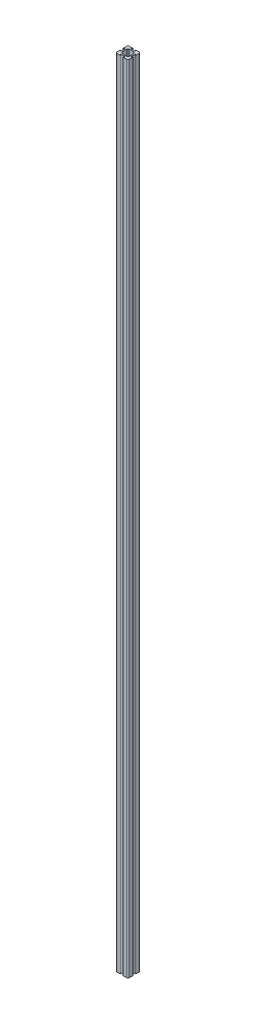
ISO-10303-21;
HEADER;
FILE_DESCRIPTION(('STEP AP214'),'2;1');
FILE_NAME('part.step','',(''),(''),'','','');
FILE_SCHEMA(('AUTOMOTIVE_DESIGN { 1 0 10303 214 1 1 1 1 }'));
ENDSEC;
DATA;
#1=APPLICATION_CONTEXT('core data for automotive mechanical design processes');
#2=APPLICATION_PROTOCOL_DEFINITION('international standard','automotive_design',2000,#1);
#3=PRODUCT_CONTEXT('',#1,'mechanical');
#4=PRODUCT('Part','Part','',(#3));
#5=PRODUCT_RELATED_PRODUCT_CATEGORY('part','',(#4));
#6=PRODUCT_DEFINITION_FORMATION('','',#4);
#7=PRODUCT_DEFINITION_CONTEXT('part definition',#1,'design');
#8=PRODUCT_DEFINITION('design','',#6,#7);
#9=PRODUCT_DEFINITION_SHAPE('','',#8);
#10=(LENGTH_UNIT() NAMED_UNIT(*) SI_UNIT(.MILLI.,.METRE.));
#11=(NAMED_UNIT(*) PLANE_ANGLE_UNIT() SI_UNIT($,.RADIAN.));
#12=(NAMED_UNIT(*) SI_UNIT($,.STERADIAN.) SOLID_ANGLE_UNIT());
#13=UNCERTAINTY_MEASURE_WITH_UNIT(LENGTH_MEASURE(1.E-05),#10,'distance_accuracy_value','');
#14=(GEOMETRIC_REPRESENTATION_CONTEXT(3) GLOBAL_UNCERTAINTY_ASSIGNED_CONTEXT((#13)) GLOBAL_UNIT_ASSIGNED_CONTEXT((#10,
#11,#12)) REPRESENTATION_CONTEXT('',''));
#15=CARTESIAN_POINT('',(0.,0.,0.));
#16=DIRECTION('',(0.,0.,1.));
#17=DIRECTION('',(1.,0.,0.));
#18=AXIS2_PLACEMENT_3D('',#15,#16,#17);
#19=CARTESIAN_POINT('',(9.5,1600.,-9.5));
#20=DIRECTION('',(0.,-1.,0.));
#21=DIRECTION('',(0.,0.,-1.));
#22=AXIS2_PLACEMENT_3D('',#19,#20,#21);
#23=PLANE('',#22);
#24=DIRECTION('',(0.707106781186551,0.,-0.707106781186544));
#25=VECTOR('',#24,1.);
#26=CARTESIAN_POINT('',(-2.5,1600.,-12.5));
#27=LINE('',#26,#25);
#28=CARTESIAN_POINT('',(-5.00000000000002,1600.,-10.));
#29=VERTEX_POINT('',#28);
#30=CARTESIAN_POINT('',(-2.5,1600.,-12.5));
#31=VERTEX_POINT('',#30);
#32=EDGE_CURVE('E308',#29,#31,#27,.T.);
#33=ORIENTED_EDGE('',*,*,#32,.T.);
#34=DIRECTION('',(-1.,0.,0.));
#35=VECTOR('',#34,1.);
#36=CARTESIAN_POINT('',(-9.49999999999998,1600.,-12.5));
#37=LINE('',#36,#35);
#38=CARTESIAN_POINT('',(-9.49999999999998,1600.,-12.5));
#39=VERTEX_POINT('',#38);
#40=EDGE_CURVE('E311',#31,#39,#37,.T.);
#41=ORIENTED_EDGE('',*,*,#40,.T.);
#42=CARTESIAN_POINT('',(-9.5,1600.,-9.5));
#43=DIRECTION('',(0.,1.,0.));
#44=DIRECTION('',(0.,0.,1.));
#45=AXIS2_PLACEMENT_3D('',#42,#43,#44);
#46=CIRCLE('',#45,3.);
#47=CARTESIAN_POINT('',(-12.5,1600.,-9.49999999999998));
#48=VERTEX_POINT('',#47);
#49=EDGE_CURVE('E314',#39,#48,#46,.T.);
#50=ORIENTED_EDGE('',*,*,#49,.T.);
#51=DIRECTION('',(0.,0.,1.));
#52=VECTOR('',#51,1.);
#53=CARTESIAN_POINT('',(-12.5,1600.,-2.5));
#54=LINE('',#53,#52);
#55=CARTESIAN_POINT('',(-12.5,1600.,-2.5));
#56=VERTEX_POINT('',#55);
#57=EDGE_CURVE('E316',#48,#56,#54,.T.);
#58=ORIENTED_EDGE('',*,*,#57,.T.);
#59=DIRECTION('',(0.707106781186552,0.,-0.707106781186543));
#60=VECTOR('',#59,1.);
#61=CARTESIAN_POINT('',(-10.,1600.,-4.99999999999997));
#62=LINE('',#61,#60);
#63=CARTESIAN_POINT('',(-10.,1600.,-4.99999999999997));
#64=VERTEX_POINT('',#63);
#65=EDGE_CURVE('E318',#56,#64,#62,.T.);
#66=ORIENTED_EDGE('',*,*,#65,.T.);
#67=DIRECTION('',(0.,0.,1.));
#68=VECTOR('',#67,1.);
#69=CARTESIAN_POINT('',(-10.,1600.,5.00000000000003));
#70=LINE('',#69,#68);
#71=CARTESIAN_POINT('',(-10.,1600.,5.00000000000003));
#72=VERTEX_POINT('',#71);
#73=EDGE_CURVE('E320',#64,#72,#70,.T.);
#74=ORIENTED_EDGE('',*,*,#73,.T.);
#75=DIRECTION('',(-0.707106781186544,0.,-0.707106781186551));
#76=VECTOR('',#75,1.);
#77=CARTESIAN_POINT('',(-12.5,1600.,2.5));
#78=LINE('',#77,#76);
#79=CARTESIAN_POINT('',(-12.5,1600.,2.5));
#80=VERTEX_POINT('',#79);
#81=EDGE_CURVE('E322',#72,#80,#78,.T.);
#82=ORIENTED_EDGE('',*,*,#81,.T.);
#83=DIRECTION('',(0.,0.,1.));
#84=VECTOR('',#83,1.);
#85=CARTESIAN_POINT('',(-12.5,1600.,9.49999999999998));
#86=LINE('',#85,#84);
#87=CARTESIAN_POINT('',(-12.5,1600.,9.49999999999998));
#88=VERTEX_POINT('',#87);
#89=EDGE_CURVE('E324',#80,#88,#86,.T.);
#90=ORIENTED_EDGE('',*,*,#89,.T.);
#91=CARTESIAN_POINT('',(-9.5,1600.,9.5));
#92=DIRECTION('',(0.,1.,0.));
#93=DIRECTION('',(0.,0.,-1.));
#94=AXIS2_PLACEMENT_3D('',#91,#92,#93);
#95=CIRCLE('',#94,3.);
#96=CARTESIAN_POINT('',(-9.49999999999998,1600.,12.5));
#97=VERTEX_POINT('',#96);
#98=EDGE_CURVE('E326',#88,#97,#95,.T.);
#99=ORIENTED_EDGE('',*,*,#98,.T.);
#100=DIRECTION('',(1.,0.,0.));
#101=VECTOR('',#100,1.);
#102=CARTESIAN_POINT('',(-2.5,1600.,12.5));
#103=LINE('',#102,#101);
#104=CARTESIAN_POINT('',(-2.5,1600.,12.5));
#105=VERTEX_POINT('',#104);
#106=EDGE_CURVE('E328',#97,#105,#103,.T.);
#107=ORIENTED_EDGE('',*,*,#106,.T.);
#108=DIRECTION('',(-0.707106781186544,0.,-0.707106781186551));
#109=VECTOR('',#108,1.);
#110=CARTESIAN_POINT('',(-2.5,1600.,12.5));
#111=LINE('',#110,#109);
#112=CARTESIAN_POINT('',(-4.99999999999998,1600.,10.));
#113=VERTEX_POINT('',#112);
#114=EDGE_CURVE('E330',#105,#113,#111,.T.);
#115=ORIENTED_EDGE('',*,*,#114,.T.);
#116=DIRECTION('',(1.,0.,0.));
#117=VECTOR('',#116,1.);
#118=CARTESIAN_POINT('',(-4.99999999999998,1600.,10.));
#119=LINE('',#118,#117);
#120=CARTESIAN_POINT('',(5.00000000000002,1600.,10.));
#121=VERTEX_POINT('',#120);
#122=EDGE_CURVE('E332',#113,#121,#119,.T.);
#123=ORIENTED_EDGE('',*,*,#122,.T.);
#124=DIRECTION('',(-0.707106781186551,0.,0.707106781186544));
#125=VECTOR('',#124,1.);
#126=CARTESIAN_POINT('',(5.00000000000002,1600.,10.));
#127=LINE('',#126,#125);
#128=CARTESIAN_POINT('',(2.5,1600.,12.5));
#129=VERTEX_POINT('',#128);
#130=EDGE_CURVE('E334',#121,#129,#127,.T.);
#131=ORIENTED_EDGE('',*,*,#130,.T.);
#132=DIRECTION('',(1.,0.,0.));
#133=VECTOR('',#132,1.);
#134=CARTESIAN_POINT('',(9.49999999999998,1600.,12.5));
#135=LINE('',#134,#133);
#136=CARTESIAN_POINT('',(9.49999999999998,1600.,12.5));
#137=VERTEX_POINT('',#136);
#138=EDGE_CURVE('E336',#129,#137,#135,.T.);
#139=ORIENTED_EDGE('',*,*,#138,.T.);
#140=CARTESIAN_POINT('',(9.5,1600.,9.5));
#141=DIRECTION('',(0.,1.,0.));
#142=DIRECTION('',(0.,0.,-1.));
#143=AXIS2_PLACEMENT_3D('',#140,#141,#142);
#144=CIRCLE('',#143,3.);
#145=CARTESIAN_POINT('',(12.5,1600.,9.49999999999998));
#146=VERTEX_POINT('',#145);
#147=EDGE_CURVE('E338',#137,#146,#144,.T.);
#148=ORIENTED_EDGE('',*,*,#147,.T.);
#149=DIRECTION('',(0.,0.,-1.));
#150=VECTOR('',#149,1.);
#151=CARTESIAN_POINT('',(12.5,1600.,2.5));
#152=LINE('',#151,#150);
#153=CARTESIAN_POINT('',(12.5,1600.,2.5));
#154=VERTEX_POINT('',#153);
#155=EDGE_CURVE('E340',#146,#154,#152,.T.);
#156=ORIENTED_EDGE('',*,*,#155,.T.);
#157=DIRECTION('',(-0.707106781186551,0.,0.707106781186544));
#158=VECTOR('',#157,1.);
#159=CARTESIAN_POINT('',(9.99999999999999,1600.,4.99999999999998));
#160=LINE('',#159,#158);
#161=CARTESIAN_POINT('',(9.99999999999999,1600.,4.99999999999998));
#162=VERTEX_POINT('',#161);
#163=EDGE_CURVE('E342',#154,#162,#160,.T.);
#164=ORIENTED_EDGE('',*,*,#163,.T.);
#165=DIRECTION('',(0.,0.,-1.));
#166=VECTOR('',#165,1.);
#167=CARTESIAN_POINT('',(10.,1600.,-5.00000000000002));
#168=LINE('',#167,#166);
#169=CARTESIAN_POINT('',(10.,1600.,-5.00000000000002));
#170=VERTEX_POINT('',#169);
#171=EDGE_CURVE('E344',#162,#170,#168,.T.);
#172=ORIENTED_EDGE('',*,*,#171,.T.);
#173=DIRECTION('',(0.707106781186545,0.,0.70710678118655));
#174=VECTOR('',#173,1.);
#175=CARTESIAN_POINT('',(12.5,1600.,-2.5));
#176=LINE('',#175,#174);
#177=CARTESIAN_POINT('',(12.5,1600.,-2.5));
#178=VERTEX_POINT('',#177);
#179=EDGE_CURVE('E346',#170,#178,#176,.T.);
#180=ORIENTED_EDGE('',*,*,#179,.T.);
#181=DIRECTION('',(0.,0.,-1.));
#182=VECTOR('',#181,1.);
#183=CARTESIAN_POINT('',(12.5,1600.,-9.49999999999998));
#184=LINE('',#183,#182);
#185=CARTESIAN_POINT('',(12.5,1600.,-9.49999999999998));
#186=VERTEX_POINT('',#185);
#187=EDGE_CURVE('E348',#178,#186,#184,.T.);
#188=ORIENTED_EDGE('',*,*,#187,.T.);
#189=CARTESIAN_POINT('',(9.5,1600.,-9.5));
#190=DIRECTION('',(0.,1.,0.));
#191=DIRECTION('',(0.,0.,-1.));
#192=AXIS2_PLACEMENT_3D('',#189,#190,#191);
#193=CIRCLE('',#192,3.);
#194=CARTESIAN_POINT('',(9.49999999999998,1600.,-12.5));
#195=VERTEX_POINT('',#194);
#196=EDGE_CURVE('E350',#186,#195,#193,.T.);
#197=ORIENTED_EDGE('',*,*,#196,.T.);
#198=DIRECTION('',(-1.,0.,0.));
#199=VECTOR('',#198,1.);
#200=CARTESIAN_POINT('',(2.5,1600.,-12.5));
#201=LINE('',#200,#199);
#202=CARTESIAN_POINT('',(2.5,1600.,-12.5));
#203=VERTEX_POINT('',#202);
#204=EDGE_CURVE('E352',#195,#203,#201,.T.);
#205=ORIENTED_EDGE('',*,*,#204,.T.);
#206=DIRECTION('',(0.707106781186544,0.,0.707106781186551));
#207=VECTOR('',#206,1.);
#208=CARTESIAN_POINT('',(4.99999999999998,1600.,-10.));
#209=LINE('',#208,#207);
#210=CARTESIAN_POINT('',(4.99999999999998,1600.,-10.));
#211=VERTEX_POINT('',#210);
#212=EDGE_CURVE('E354',#203,#211,#209,.T.);
#213=ORIENTED_EDGE('',*,*,#212,.T.);
#214=DIRECTION('',(-1.,0.,0.));
#215=VECTOR('',#214,1.);
#216=CARTESIAN_POINT('',(-5.00000000000002,1600.,-10.));
#217=LINE('',#216,#215);
#218=EDGE_CURVE('E356',#211,#29,#217,.T.);
#219=ORIENTED_EDGE('',*,*,#218,.T.);
#220=EDGE_LOOP('',(#33,#41,#50,#58,#66,#74,#82,#90,#99,#107,#115,#123,#131,#139,#148,#156,#164,
#172,#180,#188,#197,#205,#213,#219));
#221=FACE_BOUND('',#220,.T.);
#222=DIRECTION('',(0.,0.,1.));
#223=VECTOR('',#222,1.);
#224=CARTESIAN_POINT('',(-7.5,1600.,5.));
#225=LINE('',#224,#223);
#226=CARTESIAN_POINT('',(-7.5,1600.,-5.));
#227=VERTEX_POINT('',#226);
#228=CARTESIAN_POINT('',(-7.5,1600.,5.));
#229=VERTEX_POINT('',#228);
#230=EDGE_CURVE('E243',#227,#229,#225,.T.);
#231=ORIENTED_EDGE('',*,*,#230,.F.);
#232=DIRECTION('',(-0.707106781186553,0.,0.707106781186543));
#233=VECTOR('',#232,1.);
#234=CARTESIAN_POINT('',(-7.5,1600.,-5.));
#235=LINE('',#234,#233);
#236=CARTESIAN_POINT('',(-4.99999999999996,1600.,-7.5));
#237=VERTEX_POINT('',#236);
#238=EDGE_CURVE('E276',#237,#227,#235,.T.);
#239=ORIENTED_EDGE('',*,*,#238,.F.);
#240=DIRECTION('',(-1.,0.,0.));
#241=VECTOR('',#240,1.);
#242=CARTESIAN_POINT('',(-4.99999999999996,1600.,-7.5));
#243=LINE('',#242,#241);
#244=CARTESIAN_POINT('',(5.00000000000003,1600.,-7.50000000000001));
#245=VERTEX_POINT('',#244);
#246=EDGE_CURVE('E274',#245,#237,#243,.T.);
#247=ORIENTED_EDGE('',*,*,#246,.F.);
#248=DIRECTION('',(-0.707106781186543,0.,-0.707106781186552));
#249=VECTOR('',#248,1.);
#250=CARTESIAN_POINT('',(5.00000000000003,1600.,-7.50000000000001));
#251=LINE('',#250,#249);
#252=CARTESIAN_POINT('',(7.50000000000004,1600.,-4.99999999999997));
#253=VERTEX_POINT('',#252);
#254=EDGE_CURVE('E272',#253,#245,#251,.T.);
#255=ORIENTED_EDGE('',*,*,#254,.F.);
#256=DIRECTION('',(0.,0.,-1.));
#257=VECTOR('',#256,1.);
#258=CARTESIAN_POINT('',(7.50000000000004,1600.,-4.99999999999997));
#259=LINE('',#258,#257);
#260=CARTESIAN_POINT('',(7.50000000000004,1600.,5.00000000000003));
#261=VERTEX_POINT('',#260);
#262=EDGE_CURVE('E270',#261,#253,#259,.T.);
#263=ORIENTED_EDGE('',*,*,#262,.F.);
#264=DIRECTION('',(0.707106781186552,0.,-0.707106781186543));
#265=VECTOR('',#264,1.);
#266=CARTESIAN_POINT('',(7.50000000000004,1600.,5.00000000000003));
#267=LINE('',#266,#265);
#268=CARTESIAN_POINT('',(5.00000000000001,1600.,7.50000000000004));
#269=VERTEX_POINT('',#268);
#270=EDGE_CURVE('E266',#269,#261,#267,.T.);
#271=ORIENTED_EDGE('',*,*,#270,.F.);
#272=DIRECTION('',(1.,0.,0.));
#273=VECTOR('',#272,1.);
#274=CARTESIAN_POINT('',(5.00000000000001,1600.,7.50000000000004));
#275=LINE('',#274,#273);
#276=CARTESIAN_POINT('',(-4.99999999999999,1600.,7.50000000000004));
#277=VERTEX_POINT('',#276);
#278=EDGE_CURVE('E264',#277,#269,#275,.T.);
#279=ORIENTED_EDGE('',*,*,#278,.F.);
#280=DIRECTION('',(0.707106781186543,0.,0.707106781186552));
#281=VECTOR('',#280,1.);
#282=CARTESIAN_POINT('',(-4.99999999999999,1600.,7.50000000000004));
#283=LINE('',#282,#281);
#284=EDGE_CURVE('E251',#229,#277,#283,.T.);
#285=ORIENTED_EDGE('',*,*,#284,.F.);
#286=EDGE_LOOP('',(#231,#239,#247,#255,#263,#271,#279,#285));
#287=FACE_BOUND('',#286,.T.);
#288=ADVANCED_FACE('F34',(#221,#287),#23,.F.);
#289=CARTESIAN_POINT('',(9.5,0.,-9.5));
#290=DIRECTION('',(0.,-1.,0.));
#291=DIRECTION('',(0.,0.,-1.));
#292=AXIS2_PLACEMENT_3D('',#289,#290,#291);
#293=PLANE('',#292);
#294=DIRECTION('',(0.707106781186551,0.,-0.707106781186544));
#295=VECTOR('',#294,1.);
#296=CARTESIAN_POINT('',(-2.5,0.,-12.5));
#297=LINE('',#296,#295);
#298=CARTESIAN_POINT('',(-5.00000000000002,0.,-10.));
#299=VERTEX_POINT('',#298);
#300=CARTESIAN_POINT('',(-2.5,0.,-12.5));
#301=VERTEX_POINT('',#300);
#302=EDGE_CURVE('E259',#299,#301,#297,.T.);
#303=ORIENTED_EDGE('',*,*,#302,.F.);
#304=DIRECTION('',(-1.,0.,0.));
#305=VECTOR('',#304,1.);
#306=CARTESIAN_POINT('',(-5.00000000000002,0.,-10.));
#307=LINE('',#306,#305);
#308=CARTESIAN_POINT('',(4.99999999999998,0.,-10.));
#309=VERTEX_POINT('',#308);
#310=EDGE_CURVE('E312',#309,#299,#307,.T.);
#311=ORIENTED_EDGE('',*,*,#310,.F.);
#312=DIRECTION('',(0.707106781186544,0.,0.707106781186551));
#313=VECTOR('',#312,1.);
#314=CARTESIAN_POINT('',(4.99999999999998,0.,-10.));
#315=LINE('',#314,#313);
#316=CARTESIAN_POINT('',(2.5,0.,-12.5));
#317=VERTEX_POINT('',#316);
#318=EDGE_CURVE('E403',#317,#309,#315,.T.);
#319=ORIENTED_EDGE('',*,*,#318,.F.);
#320=DIRECTION('',(-1.,0.,0.));
#321=VECTOR('',#320,1.);
#322=CARTESIAN_POINT('',(2.5,0.,-12.5));
#323=LINE('',#322,#321);
#324=CARTESIAN_POINT('',(9.49999999999998,0.,-12.5));
#325=VERTEX_POINT('',#324);
#326=EDGE_CURVE('E401',#325,#317,#323,.T.);
#327=ORIENTED_EDGE('',*,*,#326,.F.);
#328=CARTESIAN_POINT('',(9.5,0.,-9.5));
#329=DIRECTION('',(0.,1.,0.));
#330=DIRECTION('',(0.,0.,-1.));
#331=AXIS2_PLACEMENT_3D('',#328,#329,#330);
#332=CIRCLE('',#331,3.);
#333=CARTESIAN_POINT('',(12.5,0.,-9.49999999999998));
#334=VERTEX_POINT('',#333);
#335=EDGE_CURVE('E399',#334,#325,#332,.T.);
#336=ORIENTED_EDGE('',*,*,#335,.F.);
#337=DIRECTION('',(0.,0.,-1.));
#338=VECTOR('',#337,1.);
#339=CARTESIAN_POINT('',(12.5,0.,-9.49999999999998));
#340=LINE('',#339,#338);
#341=CARTESIAN_POINT('',(12.5,0.,-2.5));
#342=VERTEX_POINT('',#341);
#343=EDGE_CURVE('E397',#342,#334,#340,.T.);
#344=ORIENTED_EDGE('',*,*,#343,.F.);
#345=DIRECTION('',(0.707106781186545,0.,0.70710678118655));
#346=VECTOR('',#345,1.);
#347=CARTESIAN_POINT('',(12.5,0.,-2.5));
#348=LINE('',#347,#346);
#349=CARTESIAN_POINT('',(10.,0.,-5.00000000000002));
#350=VERTEX_POINT('',#349);
#351=EDGE_CURVE('E395',#350,#342,#348,.T.);
#352=ORIENTED_EDGE('',*,*,#351,.F.);
#353=DIRECTION('',(0.,0.,-1.));
#354=VECTOR('',#353,1.);
#355=CARTESIAN_POINT('',(10.,0.,-5.00000000000002));
#356=LINE('',#355,#354);
#357=CARTESIAN_POINT('',(9.99999999999999,0.,4.99999999999998));
#358=VERTEX_POINT('',#357);
#359=EDGE_CURVE('E393',#358,#350,#356,.T.);
#360=ORIENTED_EDGE('',*,*,#359,.F.);
#361=DIRECTION('',(-0.707106781186551,0.,0.707106781186544));
#362=VECTOR('',#361,1.);
#363=CARTESIAN_POINT('',(9.99999999999999,0.,4.99999999999998));
#364=LINE('',#363,#362);
#365=CARTESIAN_POINT('',(12.5,0.,2.5));
#366=VERTEX_POINT('',#365);
#367=EDGE_CURVE('E391',#366,#358,#364,.T.);
#368=ORIENTED_EDGE('',*,*,#367,.F.);
#369=DIRECTION('',(0.,0.,-1.));
#370=VECTOR('',#369,1.);
#371=CARTESIAN_POINT('',(12.5,0.,2.5));
#372=LINE('',#371,#370);
#373=CARTESIAN_POINT('',(12.5,0.,9.49999999999998));
#374=VERTEX_POINT('',#373);
#375=EDGE_CURVE('E389',#374,#366,#372,.T.);
#376=ORIENTED_EDGE('',*,*,#375,.F.);
#377=CARTESIAN_POINT('',(9.5,0.,9.5));
#378=DIRECTION('',(0.,1.,0.));
#379=DIRECTION('',(0.,0.,-1.));
#380=AXIS2_PLACEMENT_3D('',#377,#378,#379);
#381=CIRCLE('',#380,3.);
#382=CARTESIAN_POINT('',(9.49999999999998,0.,12.5));
#383=VERTEX_POINT('',#382);
#384=EDGE_CURVE('E387',#383,#374,#381,.T.);
#385=ORIENTED_EDGE('',*,*,#384,.F.);
#386=DIRECTION('',(1.,0.,0.));
#387=VECTOR('',#386,1.);
#388=CARTESIAN_POINT('',(9.49999999999998,0.,12.5));
#389=LINE('',#388,#387);
#390=CARTESIAN_POINT('',(2.5,0.,12.5));
#391=VERTEX_POINT('',#390);
#392=EDGE_CURVE('E385',#391,#383,#389,.T.);
#393=ORIENTED_EDGE('',*,*,#392,.F.);
#394=DIRECTION('',(-0.707106781186551,0.,0.707106781186544));
#395=VECTOR('',#394,1.);
#396=CARTESIAN_POINT('',(5.00000000000002,0.,10.));
#397=LINE('',#396,#395);
#398=CARTESIAN_POINT('',(5.00000000000002,0.,10.));
#399=VERTEX_POINT('',#398);
#400=EDGE_CURVE('E383',#399,#391,#397,.T.);
#401=ORIENTED_EDGE('',*,*,#400,.F.);
#402=DIRECTION('',(1.,0.,0.));
#403=VECTOR('',#402,1.);
#404=CARTESIAN_POINT('',(-4.99999999999998,0.,10.));
#405=LINE('',#404,#403);
#406=CARTESIAN_POINT('',(-4.99999999999998,0.,10.));
#407=VERTEX_POINT('',#406);
#408=EDGE_CURVE('E381',#407,#399,#405,.T.);
#409=ORIENTED_EDGE('',*,*,#408,.F.);
#410=DIRECTION('',(-0.707106781186544,0.,-0.707106781186551));
#411=VECTOR('',#410,1.);
#412=CARTESIAN_POINT('',(-2.5,0.,12.5));
#413=LINE('',#412,#411);
#414=CARTESIAN_POINT('',(-2.5,0.,12.5));
#415=VERTEX_POINT('',#414);
#416=EDGE_CURVE('E379',#415,#407,#413,.T.);
#417=ORIENTED_EDGE('',*,*,#416,.F.);
#418=DIRECTION('',(1.,0.,0.));
#419=VECTOR('',#418,1.);
#420=CARTESIAN_POINT('',(-2.5,0.,12.5));
#421=LINE('',#420,#419);
#422=CARTESIAN_POINT('',(-9.49999999999998,0.,12.5));
#423=VERTEX_POINT('',#422);
#424=EDGE_CURVE('E377',#423,#415,#421,.T.);
#425=ORIENTED_EDGE('',*,*,#424,.F.);
#426=CARTESIAN_POINT('',(-9.5,0.,9.5));
#427=DIRECTION('',(0.,1.,0.));
#428=DIRECTION('',(0.,0.,-1.));
#429=AXIS2_PLACEMENT_3D('',#426,#427,#428);
#430=CIRCLE('',#429,3.);
#431=CARTESIAN_POINT('',(-12.5,0.,9.49999999999998));
#432=VERTEX_POINT('',#431);
#433=EDGE_CURVE('E375',#432,#423,#430,.T.);
#434=ORIENTED_EDGE('',*,*,#433,.F.);
#435=DIRECTION('',(0.,0.,1.));
#436=VECTOR('',#435,1.);
#437=CARTESIAN_POINT('',(-12.5,0.,9.49999999999998));
#438=LINE('',#437,#436);
#439=CARTESIAN_POINT('',(-12.5,0.,2.5));
#440=VERTEX_POINT('',#439);
#441=EDGE_CURVE('E373',#440,#432,#438,.T.);
#442=ORIENTED_EDGE('',*,*,#441,.F.);
#443=DIRECTION('',(-0.707106781186544,0.,-0.707106781186551));
#444=VECTOR('',#443,1.);
#445=CARTESIAN_POINT('',(-12.5,0.,2.5));
#446=LINE('',#445,#444);
#447=CARTESIAN_POINT('',(-10.,0.,5.00000000000003));
#448=VERTEX_POINT('',#447);
#449=EDGE_CURVE('E371',#448,#440,#446,.T.);
#450=ORIENTED_EDGE('',*,*,#449,.F.);
#451=DIRECTION('',(0.,0.,1.));
#452=VECTOR('',#451,1.);
#453=CARTESIAN_POINT('',(-10.,0.,5.00000000000003));
#454=LINE('',#453,#452);
#455=CARTESIAN_POINT('',(-10.,0.,-4.99999999999997));
#456=VERTEX_POINT('',#455);
#457=EDGE_CURVE('E369',#456,#448,#454,.T.);
#458=ORIENTED_EDGE('',*,*,#457,.F.);
#459=DIRECTION('',(0.707106781186552,0.,-0.707106781186543));
#460=VECTOR('',#459,1.);
#461=CARTESIAN_POINT('',(-10.,0.,-4.99999999999997));
#462=LINE('',#461,#460);
#463=CARTESIAN_POINT('',(-12.5,0.,-2.5));
#464=VERTEX_POINT('',#463);
#465=EDGE_CURVE('E367',#464,#456,#462,.T.);
#466=ORIENTED_EDGE('',*,*,#465,.F.);
#467=DIRECTION('',(0.,0.,1.));
#468=VECTOR('',#467,1.);
#469=CARTESIAN_POINT('',(-12.5,0.,-2.5));
#470=LINE('',#469,#468);
#471=CARTESIAN_POINT('',(-12.5,0.,-9.49999999999998));
#472=VERTEX_POINT('',#471);
#473=EDGE_CURVE('E365',#472,#464,#470,.T.);
#474=ORIENTED_EDGE('',*,*,#473,.F.);
#475=CARTESIAN_POINT('',(-9.5,0.,-9.5));
#476=DIRECTION('',(0.,1.,0.));
#477=DIRECTION('',(0.,0.,1.));
#478=AXIS2_PLACEMENT_3D('',#475,#476,#477);
#479=CIRCLE('',#478,3.);
#480=CARTESIAN_POINT('',(-9.49999999999998,0.,-12.5));
#481=VERTEX_POINT('',#480);
#482=EDGE_CURVE('E363',#481,#472,#479,.T.);
#483=ORIENTED_EDGE('',*,*,#482,.F.);
#484=DIRECTION('',(-1.,0.,0.));
#485=VECTOR('',#484,1.);
#486=CARTESIAN_POINT('',(-9.49999999999998,0.,-12.5));
#487=LINE('',#486,#485);
#488=EDGE_CURVE('E361',#301,#481,#487,.T.);
#489=ORIENTED_EDGE('',*,*,#488,.F.);
#490=EDGE_LOOP('',(#303,#311,#319,#327,#336,#344,#352,#360,#368,#376,#385,#393,#401,#409,#417,
#425,#434,#442,#450,#458,#466,#474,#483,#489));
#491=FACE_BOUND('',#490,.T.);
#492=DIRECTION('',(-0.707106781186553,0.,0.707106781186543));
#493=VECTOR('',#492,1.);
#494=CARTESIAN_POINT('',(-7.5,0.,-5.));
#495=LINE('',#494,#493);
#496=CARTESIAN_POINT('',(-4.99999999999996,0.,-7.5));
#497=VERTEX_POINT('',#496);
#498=CARTESIAN_POINT('',(-7.5,0.,-5.));
#499=VERTEX_POINT('',#498);
#500=EDGE_CURVE('E252',#497,#499,#495,.T.);
#501=ORIENTED_EDGE('',*,*,#500,.T.);
#502=DIRECTION('',(0.,0.,1.));
#503=VECTOR('',#502,1.);
#504=CARTESIAN_POINT('',(-7.5,0.,5.));
#505=LINE('',#504,#503);
#506=CARTESIAN_POINT('',(-7.5,0.,5.));
#507=VERTEX_POINT('',#506);
#508=EDGE_CURVE('E57',#499,#507,#505,.T.);
#509=ORIENTED_EDGE('',*,*,#508,.T.);
#510=DIRECTION('',(0.707106781186543,0.,0.707106781186552));
#511=VECTOR('',#510,1.);
#512=CARTESIAN_POINT('',(-4.99999999999999,0.,7.50000000000004));
#513=LINE('',#512,#511);
#514=CARTESIAN_POINT('',(-4.99999999999999,0.,7.50000000000004));
#515=VERTEX_POINT('',#514);
#516=EDGE_CURVE('E258',#507,#515,#513,.T.);
#517=ORIENTED_EDGE('',*,*,#516,.T.);
#518=DIRECTION('',(1.,0.,0.));
#519=VECTOR('',#518,1.);
#520=CARTESIAN_POINT('',(5.00000000000001,0.,7.50000000000004));
#521=LINE('',#520,#519);
#522=CARTESIAN_POINT('',(5.00000000000001,0.,7.50000000000004));
#523=VERTEX_POINT('',#522);
#524=EDGE_CURVE('E280',#515,#523,#521,.T.);
#525=ORIENTED_EDGE('',*,*,#524,.T.);
#526=DIRECTION('',(0.707106781186552,0.,-0.707106781186543));
#527=VECTOR('',#526,1.);
#528=CARTESIAN_POINT('',(7.50000000000004,0.,5.00000000000003));
#529=LINE('',#528,#527);
#530=CARTESIAN_POINT('',(7.50000000000004,0.,5.00000000000003));
#531=VERTEX_POINT('',#530);
#532=EDGE_CURVE('E283',#523,#531,#529,.T.);
#533=ORIENTED_EDGE('',*,*,#532,.T.);
#534=DIRECTION('',(0.,0.,-1.));
#535=VECTOR('',#534,1.);
#536=CARTESIAN_POINT('',(7.50000000000004,0.,-4.99999999999997));
#537=LINE('',#536,#535);
#538=CARTESIAN_POINT('',(7.50000000000004,0.,-4.99999999999997));
#539=VERTEX_POINT('',#538);
#540=EDGE_CURVE('E286',#531,#539,#537,.T.);
#541=ORIENTED_EDGE('',*,*,#540,.T.);
#542=DIRECTION('',(-0.707106781186543,0.,-0.707106781186552));
#543=VECTOR('',#542,1.);
#544=CARTESIAN_POINT('',(5.00000000000003,0.,-7.50000000000001));
#545=LINE('',#544,#543);
#546=CARTESIAN_POINT('',(5.00000000000003,0.,-7.50000000000001));
#547=VERTEX_POINT('',#546);
#548=EDGE_CURVE('E289',#539,#547,#545,.T.);
#549=ORIENTED_EDGE('',*,*,#548,.T.);
#550=DIRECTION('',(-1.,0.,0.));
#551=VECTOR('',#550,1.);
#552=CARTESIAN_POINT('',(-4.99999999999996,0.,-7.5));
#553=LINE('',#552,#551);
#554=EDGE_CURVE('E292',#547,#497,#553,.T.);
#555=ORIENTED_EDGE('',*,*,#554,.T.);
#556=EDGE_LOOP('',(#501,#509,#517,#525,#533,#541,#549,#555));
#557=FACE_BOUND('',#556,.T.);
#558=ADVANCED_FACE('F481',(#491,#557),#293,.T.);
#559=CARTESIAN_POINT('',(-2.5,1600.,-12.5));
#560=DIRECTION('',(-0.707106781186544,0.,-0.707106781186551));
#561=DIRECTION('',(-0.707106781186551,0.,0.707106781186544));
#562=AXIS2_PLACEMENT_3D('',#559,#560,#561);
#563=PLANE('',#562);
#564=ORIENTED_EDGE('',*,*,#302,.T.);
#565=DIRECTION('',(0.,-1.,0.));
#566=VECTOR('',#565,1.);
#567=CARTESIAN_POINT('',(-2.5,1600.,-12.5));
#568=LINE('',#567,#566);
#569=EDGE_CURVE('E11',#31,#301,#568,.T.);
#570=ORIENTED_EDGE('',*,*,#569,.F.);
#571=ORIENTED_EDGE('',*,*,#32,.F.);
#572=DIRECTION('',(0.,-1.,0.));
#573=VECTOR('',#572,1.);
#574=CARTESIAN_POINT('',(-5.00000000000002,1600.,-10.));
#575=LINE('',#574,#573);
#576=EDGE_CURVE('E358',#29,#299,#575,.T.);
#577=ORIENTED_EDGE('',*,*,#576,.T.);
#578=EDGE_LOOP('',(#564,#570,#571,#577));
#579=FACE_BOUND('',#578,.T.);
#580=ADVANCED_FACE('F36',(#579),#563,.F.);
#581=CARTESIAN_POINT('',(-9.49999999999998,1600.,-12.5));
#582=DIRECTION('',(0.,0.,1.));
#583=DIRECTION('',(1.,0.,0.));
#584=AXIS2_PLACEMENT_3D('',#581,#582,#583);
#585=PLANE('',#584);
#586=ORIENTED_EDGE('',*,*,#488,.T.);
#587=DIRECTION('',(0.,-1.,0.));
#588=VECTOR('',#587,1.);
#589=CARTESIAN_POINT('',(-9.49999999999998,1600.,-12.5));
#590=LINE('',#589,#588);
#591=EDGE_CURVE('E42',#39,#481,#590,.T.);
#592=ORIENTED_EDGE('',*,*,#591,.F.);
#593=ORIENTED_EDGE('',*,*,#40,.F.);
#594=ORIENTED_EDGE('',*,*,#569,.T.);
#595=EDGE_LOOP('',(#586,#592,#593,#594));
#596=FACE_BOUND('',#595,.T.);
#597=ADVANCED_FACE('F498',(#596),#585,.F.);
#598=CARTESIAN_POINT('',(-9.5,1600.,-9.5));
#599=DIRECTION('',(0.,-1.,0.));
#600=DIRECTION('',(0.,0.,-1.));
#601=AXIS2_PLACEMENT_3D('',#598,#599,#600);
#602=CYLINDRICAL_SURFACE('',#601,3.);
#603=ORIENTED_EDGE('',*,*,#482,.T.);
#604=DIRECTION('',(0.,-1.,0.));
#605=VECTOR('',#604,1.);
#606=CARTESIAN_POINT('',(-12.5,1600.,-9.49999999999998));
#607=LINE('',#606,#605);
#608=EDGE_CURVE('E468',#48,#472,#607,.T.);
#609=ORIENTED_EDGE('',*,*,#608,.F.);
#610=ORIENTED_EDGE('',*,*,#49,.F.);
#611=ORIENTED_EDGE('',*,*,#591,.T.);
#612=EDGE_LOOP('',(#603,#609,#610,#611));
#613=FACE_BOUND('',#612,.T.);
#614=ADVANCED_FACE('F475',(#613),#602,.T.);
#615=CARTESIAN_POINT('',(-12.5,1600.,-2.5));
#616=DIRECTION('',(1.,0.,0.));
#617=DIRECTION('',(0.,0.,-1.));
#618=AXIS2_PLACEMENT_3D('',#615,#616,#617);
#619=PLANE('',#618);
#620=ORIENTED_EDGE('',*,*,#473,.T.);
#621=DIRECTION('',(0.,-1.,0.));
#622=VECTOR('',#621,1.);
#623=CARTESIAN_POINT('',(-12.5,1600.,-2.5));
#624=LINE('',#623,#622);
#625=EDGE_CURVE('E465',#56,#464,#624,.T.);
#626=ORIENTED_EDGE('',*,*,#625,.F.);
#627=ORIENTED_EDGE('',*,*,#57,.F.);
#628=ORIENTED_EDGE('',*,*,#608,.T.);
#629=EDGE_LOOP('',(#620,#626,#627,#628));
#630=FACE_BOUND('',#629,.T.);
#631=ADVANCED_FACE('F487',(#630),#619,.F.);
#632=CARTESIAN_POINT('',(-10.,1600.,-4.99999999999997));
#633=DIRECTION('',(-0.707106781186543,0.,-0.707106781186552));
#634=DIRECTION('',(-0.707106781186552,0.,0.707106781186543));
#635=AXIS2_PLACEMENT_3D('',#632,#633,#634);
#636=PLANE('',#635);
#637=ORIENTED_EDGE('',*,*,#465,.T.);
#638=DIRECTION('',(0.,-1.,0.));
#639=VECTOR('',#638,1.);
#640=CARTESIAN_POINT('',(-10.,1600.,-4.99999999999997));
#641=LINE('',#640,#639);
#642=EDGE_CURVE('E462',#64,#456,#641,.T.);
#643=ORIENTED_EDGE('',*,*,#642,.F.);
#644=ORIENTED_EDGE('',*,*,#65,.F.);
#645=ORIENTED_EDGE('',*,*,#625,.T.);
#646=EDGE_LOOP('',(#637,#643,#644,#645));
#647=FACE_BOUND('',#646,.T.);
#648=ADVANCED_FACE('F491',(#647),#636,.F.);
#649=CARTESIAN_POINT('',(-10.,1600.,5.00000000000003));
#650=DIRECTION('',(1.,0.,0.));
#651=DIRECTION('',(0.,0.,-1.));
#652=AXIS2_PLACEMENT_3D('',#649,#650,#651);
#653=PLANE('',#652);
#654=ORIENTED_EDGE('',*,*,#457,.T.);
#655=DIRECTION('',(0.,-1.,0.));
#656=VECTOR('',#655,1.);
#657=CARTESIAN_POINT('',(-10.,1600.,5.00000000000003));
#658=LINE('',#657,#656);
#659=EDGE_CURVE('E459',#72,#448,#658,.T.);
#660=ORIENTED_EDGE('',*,*,#659,.F.);
#661=ORIENTED_EDGE('',*,*,#73,.F.);
#662=ORIENTED_EDGE('',*,*,#642,.T.);
#663=EDGE_LOOP('',(#654,#660,#661,#662));
#664=FACE_BOUND('',#663,.T.);
#665=ADVANCED_FACE('F591',(#664),#653,.F.);
#666=CARTESIAN_POINT('',(-12.5,1600.,2.5));
#667=DIRECTION('',(-0.707106781186551,0.,0.707106781186544));
#668=DIRECTION('',(0.707106781186544,0.,0.707106781186551));
#669=AXIS2_PLACEMENT_3D('',#666,#667,#668);
#670=PLANE('',#669);
#671=ORIENTED_EDGE('',*,*,#449,.T.);
#672=DIRECTION('',(0.,-1.,0.));
#673=VECTOR('',#672,1.);
#674=CARTESIAN_POINT('',(-12.5,1600.,2.5));
#675=LINE('',#674,#673);
#676=EDGE_CURVE('E456',#80,#440,#675,.T.);
#677=ORIENTED_EDGE('',*,*,#676,.F.);
#678=ORIENTED_EDGE('',*,*,#81,.F.);
#679=ORIENTED_EDGE('',*,*,#659,.T.);
#680=EDGE_LOOP('',(#671,#677,#678,#679));
#681=FACE_BOUND('',#680,.T.);
#682=ADVANCED_FACE('F589',(#681),#670,.F.);
#683=CARTESIAN_POINT('',(-12.5,1600.,9.49999999999998));
#684=DIRECTION('',(1.,0.,0.));
#685=DIRECTION('',(0.,0.,-1.));
#686=AXIS2_PLACEMENT_3D('',#683,#684,#685);
#687=PLANE('',#686);
#688=ORIENTED_EDGE('',*,*,#441,.T.);
#689=DIRECTION('',(0.,-1.,0.));
#690=VECTOR('',#689,1.);
#691=CARTESIAN_POINT('',(-12.5,1600.,9.49999999999998));
#692=LINE('',#691,#690);
#693=EDGE_CURVE('E453',#88,#432,#692,.T.);
#694=ORIENTED_EDGE('',*,*,#693,.F.);
#695=ORIENTED_EDGE('',*,*,#89,.F.);
#696=ORIENTED_EDGE('',*,*,#676,.T.);
#697=EDGE_LOOP('',(#688,#694,#695,#696));
#698=FACE_BOUND('',#697,.T.);
#699=ADVANCED_FACE('F585',(#698),#687,.F.);
#700=CARTESIAN_POINT('',(-9.5,1600.,9.5));
#701=DIRECTION('',(0.,-1.,0.));
#702=DIRECTION('',(0.,0.,-1.));
#703=AXIS2_PLACEMENT_3D('',#700,#701,#702);
#704=CYLINDRICAL_SURFACE('',#703,3.);
#705=ORIENTED_EDGE('',*,*,#433,.T.);
#706=DIRECTION('',(0.,-1.,0.));
#707=VECTOR('',#706,1.);
#708=CARTESIAN_POINT('',(-9.49999999999998,1600.,12.5));
#709=LINE('',#708,#707);
#710=EDGE_CURVE('E450',#97,#423,#709,.T.);
#711=ORIENTED_EDGE('',*,*,#710,.F.);
#712=ORIENTED_EDGE('',*,*,#98,.F.);
#713=ORIENTED_EDGE('',*,*,#693,.T.);
#714=EDGE_LOOP('',(#705,#711,#712,#713));
#715=FACE_BOUND('',#714,.T.);
#716=ADVANCED_FACE('F580',(#715),#704,.T.);
#717=CARTESIAN_POINT('',(-2.5,1600.,12.5));
#718=DIRECTION('',(0.,0.,-1.));
#719=DIRECTION('',(-1.,0.,0.));
#720=AXIS2_PLACEMENT_3D('',#717,#718,#719);
#721=PLANE('',#720);
#722=ORIENTED_EDGE('',*,*,#424,.T.);
#723=DIRECTION('',(0.,-1.,0.));
#724=VECTOR('',#723,1.);
#725=CARTESIAN_POINT('',(-2.5,1600.,12.5));
#726=LINE('',#725,#724);
#727=EDGE_CURVE('E447',#105,#415,#726,.T.);
#728=ORIENTED_EDGE('',*,*,#727,.F.);
#729=ORIENTED_EDGE('',*,*,#106,.F.);
#730=ORIENTED_EDGE('',*,*,#710,.T.);
#731=EDGE_LOOP('',(#722,#728,#729,#730));
#732=FACE_BOUND('',#731,.T.);
#733=ADVANCED_FACE('F574',(#732),#721,.F.);
#734=CARTESIAN_POINT('',(-2.5,1600.,12.5));
#735=DIRECTION('',(-0.707106781186551,0.,0.707106781186544));
#736=DIRECTION('',(0.707106781186544,0.,0.707106781186551));
#737=AXIS2_PLACEMENT_3D('',#734,#735,#736);
#738=PLANE('',#737);
#739=ORIENTED_EDGE('',*,*,#416,.T.);
#740=DIRECTION('',(0.,-1.,0.));
#741=VECTOR('',#740,1.);
#742=CARTESIAN_POINT('',(-4.99999999999998,1600.,10.));
#743=LINE('',#742,#741);
#744=EDGE_CURVE('E444',#113,#407,#743,.T.);
#745=ORIENTED_EDGE('',*,*,#744,.F.);
#746=ORIENTED_EDGE('',*,*,#114,.F.);
#747=ORIENTED_EDGE('',*,*,#727,.T.);
#748=EDGE_LOOP('',(#739,#745,#746,#747));
#749=FACE_BOUND('',#748,.T.);
#750=ADVANCED_FACE('F570',(#749),#738,.F.);
#751=CARTESIAN_POINT('',(-4.99999999999998,1600.,10.));
#752=DIRECTION('',(0.,0.,-1.));
#753=DIRECTION('',(-1.,0.,0.));
#754=AXIS2_PLACEMENT_3D('',#751,#752,#753);
#755=PLANE('',#754);
#756=ORIENTED_EDGE('',*,*,#408,.T.);
#757=DIRECTION('',(0.,-1.,0.));
#758=VECTOR('',#757,1.);
#759=CARTESIAN_POINT('',(5.00000000000002,1600.,10.));
#760=LINE('',#759,#758);
#761=EDGE_CURVE('E441',#121,#399,#760,.T.);
#762=ORIENTED_EDGE('',*,*,#761,.F.);
#763=ORIENTED_EDGE('',*,*,#122,.F.);
#764=ORIENTED_EDGE('',*,*,#744,.T.);
#765=EDGE_LOOP('',(#756,#762,#763,#764));
#766=FACE_BOUND('',#765,.T.);
#767=ADVANCED_FACE('F565',(#766),#755,.F.);
#768=CARTESIAN_POINT('',(5.00000000000002,1600.,10.));
#769=DIRECTION('',(0.707106781186544,0.,0.707106781186551));
#770=DIRECTION('',(0.707106781186551,0.,-0.707106781186544));
#771=AXIS2_PLACEMENT_3D('',#768,#769,#770);
#772=PLANE('',#771);
#773=ORIENTED_EDGE('',*,*,#400,.T.);
#774=DIRECTION('',(0.,-1.,0.));
#775=VECTOR('',#774,1.);
#776=CARTESIAN_POINT('',(2.5,1600.,12.5));
#777=LINE('',#776,#775);
#778=EDGE_CURVE('E438',#129,#391,#777,.T.);
#779=ORIENTED_EDGE('',*,*,#778,.F.);
#780=ORIENTED_EDGE('',*,*,#130,.F.);
#781=ORIENTED_EDGE('',*,*,#761,.T.);
#782=EDGE_LOOP('',(#773,#779,#780,#781));
#783=FACE_BOUND('',#782,.T.);
#784=ADVANCED_FACE('F559',(#783),#772,.F.);
#785=CARTESIAN_POINT('',(9.49999999999998,1600.,12.5));
#786=DIRECTION('',(0.,0.,-1.));
#787=DIRECTION('',(-1.,0.,0.));
#788=AXIS2_PLACEMENT_3D('',#785,#786,#787);
#789=PLANE('',#788);
#790=ORIENTED_EDGE('',*,*,#392,.T.);
#791=DIRECTION('',(0.,-1.,0.));
#792=VECTOR('',#791,1.);
#793=CARTESIAN_POINT('',(9.49999999999998,1600.,12.5));
#794=LINE('',#793,#792);
#795=EDGE_CURVE('E435',#137,#383,#794,.T.);
#796=ORIENTED_EDGE('',*,*,#795,.F.);
#797=ORIENTED_EDGE('',*,*,#138,.F.);
#798=ORIENTED_EDGE('',*,*,#778,.T.);
#799=EDGE_LOOP('',(#790,#796,#797,#798));
#800=FACE_BOUND('',#799,.T.);
#801=ADVANCED_FACE('F555',(#800),#789,.F.);
#802=CARTESIAN_POINT('',(9.5,1600.,9.5));
#803=DIRECTION('',(0.,-1.,0.));
#804=DIRECTION('',(0.,0.,-1.));
#805=AXIS2_PLACEMENT_3D('',#802,#803,#804);
#806=CYLINDRICAL_SURFACE('',#805,3.);
#807=ORIENTED_EDGE('',*,*,#384,.T.);
#808=DIRECTION('',(0.,-1.,0.));
#809=VECTOR('',#808,1.);
#810=CARTESIAN_POINT('',(12.5,1600.,9.49999999999998));
#811=LINE('',#810,#809);
#812=EDGE_CURVE('E432',#146,#374,#811,.T.);
#813=ORIENTED_EDGE('',*,*,#812,.F.);
#814=ORIENTED_EDGE('',*,*,#147,.F.);
#815=ORIENTED_EDGE('',*,*,#795,.T.);
#816=EDGE_LOOP('',(#807,#813,#814,#815));
#817=FACE_BOUND('',#816,.T.);
#818=ADVANCED_FACE('F550',(#817),#806,.T.);
#819=CARTESIAN_POINT('',(12.5,1600.,2.5));
#820=DIRECTION('',(-1.,0.,0.));
#821=DIRECTION('',(0.,0.,1.));
#822=AXIS2_PLACEMENT_3D('',#819,#820,#821);
#823=PLANE('',#822);
#824=ORIENTED_EDGE('',*,*,#375,.T.);
#825=DIRECTION('',(0.,-1.,0.));
#826=VECTOR('',#825,1.);
#827=CARTESIAN_POINT('',(12.5,1600.,2.5));
#828=LINE('',#827,#826);
#829=EDGE_CURVE('E429',#154,#366,#828,.T.);
#830=ORIENTED_EDGE('',*,*,#829,.F.);
#831=ORIENTED_EDGE('',*,*,#155,.F.);
#832=ORIENTED_EDGE('',*,*,#812,.T.);
#833=EDGE_LOOP('',(#824,#830,#831,#832));
#834=FACE_BOUND('',#833,.T.);
#835=ADVANCED_FACE('F544',(#834),#823,.F.);
#836=CARTESIAN_POINT('',(9.99999999999999,1600.,4.99999999999998));
#837=DIRECTION('',(0.707106781186544,0.,0.707106781186551));
#838=DIRECTION('',(0.707106781186551,0.,-0.707106781186544));
#839=AXIS2_PLACEMENT_3D('',#836,#837,#838);
#840=PLANE('',#839);
#841=ORIENTED_EDGE('',*,*,#367,.T.);
#842=DIRECTION('',(0.,-1.,0.));
#843=VECTOR('',#842,1.);
#844=CARTESIAN_POINT('',(9.99999999999999,1600.,4.99999999999998));
#845=LINE('',#844,#843);
#846=EDGE_CURVE('E426',#162,#358,#845,.T.);
#847=ORIENTED_EDGE('',*,*,#846,.F.);
#848=ORIENTED_EDGE('',*,*,#163,.F.);
#849=ORIENTED_EDGE('',*,*,#829,.T.);
#850=EDGE_LOOP('',(#841,#847,#848,#849));
#851=FACE_BOUND('',#850,.T.);
#852=ADVANCED_FACE('F540',(#851),#840,.F.);
#853=CARTESIAN_POINT('',(10.,1600.,-5.00000000000002));
#854=DIRECTION('',(-1.,0.,0.));
#855=DIRECTION('',(0.,0.,1.));
#856=AXIS2_PLACEMENT_3D('',#853,#854,#855);
#857=PLANE('',#856);
#858=ORIENTED_EDGE('',*,*,#359,.T.);
#859=DIRECTION('',(0.,-1.,0.));
#860=VECTOR('',#859,1.);
#861=CARTESIAN_POINT('',(10.,1600.,-5.00000000000002));
#862=LINE('',#861,#860);
#863=EDGE_CURVE('E423',#170,#350,#862,.T.);
#864=ORIENTED_EDGE('',*,*,#863,.F.);
#865=ORIENTED_EDGE('',*,*,#171,.F.);
#866=ORIENTED_EDGE('',*,*,#846,.T.);
#867=EDGE_LOOP('',(#858,#864,#865,#866));
#868=FACE_BOUND('',#867,.T.);
#869=ADVANCED_FACE('F535',(#868),#857,.F.);
#870=CARTESIAN_POINT('',(12.5,1600.,-2.5));
#871=DIRECTION('',(0.70710678118655,0.,-0.707106781186545));
#872=DIRECTION('',(-0.707106781186545,0.,-0.70710678118655));
#873=AXIS2_PLACEMENT_3D('',#870,#871,#872);
#874=PLANE('',#873);
#875=ORIENTED_EDGE('',*,*,#351,.T.);
#876=DIRECTION('',(0.,-1.,0.));
#877=VECTOR('',#876,1.);
#878=CARTESIAN_POINT('',(12.5,1600.,-2.5));
#879=LINE('',#878,#877);
#880=EDGE_CURVE('E420',#178,#342,#879,.T.);
#881=ORIENTED_EDGE('',*,*,#880,.F.);
#882=ORIENTED_EDGE('',*,*,#179,.F.);
#883=ORIENTED_EDGE('',*,*,#863,.T.);
#884=EDGE_LOOP('',(#875,#881,#882,#883));
#885=FACE_BOUND('',#884,.T.);
#886=ADVANCED_FACE('F529',(#885),#874,.F.);
#887=CARTESIAN_POINT('',(12.5,1600.,-9.49999999999998));
#888=DIRECTION('',(-1.,0.,0.));
#889=DIRECTION('',(0.,0.,1.));
#890=AXIS2_PLACEMENT_3D('',#887,#888,#889);
#891=PLANE('',#890);
#892=ORIENTED_EDGE('',*,*,#343,.T.);
#893=DIRECTION('',(0.,-1.,0.));
#894=VECTOR('',#893,1.);
#895=CARTESIAN_POINT('',(12.5,1600.,-9.49999999999998));
#896=LINE('',#895,#894);
#897=EDGE_CURVE('E417',#186,#334,#896,.T.);
#898=ORIENTED_EDGE('',*,*,#897,.F.);
#899=ORIENTED_EDGE('',*,*,#187,.F.);
#900=ORIENTED_EDGE('',*,*,#880,.T.);
#901=EDGE_LOOP('',(#892,#898,#899,#900));
#902=FACE_BOUND('',#901,.T.);
#903=ADVANCED_FACE('F525',(#902),#891,.F.);
#904=CARTESIAN_POINT('',(9.5,1600.,-9.5));
#905=DIRECTION('',(0.,-1.,0.));
#906=DIRECTION('',(0.,0.,-1.));
#907=AXIS2_PLACEMENT_3D('',#904,#905,#906);
#908=CYLINDRICAL_SURFACE('',#907,3.);
#909=ORIENTED_EDGE('',*,*,#335,.T.);
#910=DIRECTION('',(0.,-1.,0.));
#911=VECTOR('',#910,1.);
#912=CARTESIAN_POINT('',(9.49999999999998,1600.,-12.5));
#913=LINE('',#912,#911);
#914=EDGE_CURVE('E414',#195,#325,#913,.T.);
#915=ORIENTED_EDGE('',*,*,#914,.F.);
#916=ORIENTED_EDGE('',*,*,#196,.F.);
#917=ORIENTED_EDGE('',*,*,#897,.T.);
#918=EDGE_LOOP('',(#909,#915,#916,#917));
#919=FACE_BOUND('',#918,.T.);
#920=ADVANCED_FACE('F520',(#919),#908,.T.);
#921=CARTESIAN_POINT('',(2.5,1600.,-12.5));
#922=DIRECTION('',(0.,0.,1.));
#923=DIRECTION('',(1.,0.,0.));
#924=AXIS2_PLACEMENT_3D('',#921,#922,#923);
#925=PLANE('',#924);
#926=ORIENTED_EDGE('',*,*,#326,.T.);
#927=DIRECTION('',(0.,-1.,0.));
#928=VECTOR('',#927,1.);
#929=CARTESIAN_POINT('',(2.5,1600.,-12.5));
#930=LINE('',#929,#928);
#931=EDGE_CURVE('E411',#203,#317,#930,.T.);
#932=ORIENTED_EDGE('',*,*,#931,.F.);
#933=ORIENTED_EDGE('',*,*,#204,.F.);
#934=ORIENTED_EDGE('',*,*,#914,.T.);
#935=EDGE_LOOP('',(#926,#932,#933,#934));
#936=FACE_BOUND('',#935,.T.);
#937=ADVANCED_FACE('F514',(#936),#925,.F.);
#938=CARTESIAN_POINT('',(4.99999999999998,1600.,-10.));
#939=DIRECTION('',(0.707106781186551,0.,-0.707106781186544));
#940=DIRECTION('',(-0.707106781186544,0.,-0.707106781186551));
#941=AXIS2_PLACEMENT_3D('',#938,#939,#940);
#942=PLANE('',#941);
#943=ORIENTED_EDGE('',*,*,#318,.T.);
#944=DIRECTION('',(0.,-1.,0.));
#945=VECTOR('',#944,1.);
#946=CARTESIAN_POINT('',(4.99999999999998,1600.,-10.));
#947=LINE('',#946,#945);
#948=EDGE_CURVE('E408',#211,#309,#947,.T.);
#949=ORIENTED_EDGE('',*,*,#948,.F.);
#950=ORIENTED_EDGE('',*,*,#212,.F.);
#951=ORIENTED_EDGE('',*,*,#931,.T.);
#952=EDGE_LOOP('',(#943,#949,#950,#951));
#953=FACE_BOUND('',#952,.T.);
#954=ADVANCED_FACE('F510',(#953),#942,.F.);
#955=CARTESIAN_POINT('',(-5.00000000000002,1600.,-10.));
#956=DIRECTION('',(0.,0.,1.));
#957=DIRECTION('',(1.,0.,0.));
#958=AXIS2_PLACEMENT_3D('',#955,#956,#957);
#959=PLANE('',#958);
#960=ORIENTED_EDGE('',*,*,#310,.T.);
#961=ORIENTED_EDGE('',*,*,#576,.F.);
#962=ORIENTED_EDGE('',*,*,#218,.F.);
#963=ORIENTED_EDGE('',*,*,#948,.T.);
#964=EDGE_LOOP('',(#960,#961,#962,#963));
#965=FACE_BOUND('',#964,.T.);
#966=ADVANCED_FACE('F505',(#965),#959,.F.);
#967=CARTESIAN_POINT('',(-7.5,1600.,5.));
#968=DIRECTION('',(1.,0.,0.));
#969=DIRECTION('',(0.,0.,-1.));
#970=AXIS2_PLACEMENT_3D('',#967,#968,#969);
#971=PLANE('',#970);
#972=ORIENTED_EDGE('',*,*,#508,.F.);
#973=DIRECTION('',(0.,-1.,0.));
#974=VECTOR('',#973,1.);
#975=CARTESIAN_POINT('',(-7.5,1600.,-5.));
#976=LINE('',#975,#974);
#977=EDGE_CURVE('E247',#227,#499,#976,.T.);
#978=ORIENTED_EDGE('',*,*,#977,.F.);
#979=ORIENTED_EDGE('',*,*,#230,.T.);
#980=DIRECTION('',(0.,-1.,0.));
#981=VECTOR('',#980,1.);
#982=CARTESIAN_POINT('',(-7.5,1600.,5.));
#983=LINE('',#982,#981);
#984=EDGE_CURVE('E246',#229,#507,#983,.T.);
#985=ORIENTED_EDGE('',*,*,#984,.T.);
#986=EDGE_LOOP('',(#972,#978,#979,#985));
#987=FACE_BOUND('',#986,.T.);
#988=ADVANCED_FACE('F245',(#987),#971,.T.);
#989=CARTESIAN_POINT('',(-4.99999999999999,1600.,7.50000000000004));
#990=DIRECTION('',(0.707106781186552,0.,-0.707106781186543));
#991=DIRECTION('',(-0.707106781186543,0.,-0.707106781186552));
#992=AXIS2_PLACEMENT_3D('',#989,#990,#991);
#993=PLANE('',#992);
#994=ORIENTED_EDGE('',*,*,#516,.F.);
#995=ORIENTED_EDGE('',*,*,#984,.F.);
#996=ORIENTED_EDGE('',*,*,#284,.T.);
#997=DIRECTION('',(0.,-1.,0.));
#998=VECTOR('',#997,1.);
#999=CARTESIAN_POINT('',(-4.99999999999999,1600.,7.50000000000004));
#1000=LINE('',#999,#998);
#1001=EDGE_CURVE('E260',#277,#515,#1000,.T.);
#1002=ORIENTED_EDGE('',*,*,#1001,.T.);
#1003=EDGE_LOOP('',(#994,#995,#996,#1002));
#1004=FACE_BOUND('',#1003,.T.);
#1005=ADVANCED_FACE('F255',(#1004),#993,.T.);
#1006=CARTESIAN_POINT('',(5.00000000000001,1600.,7.50000000000004));
#1007=DIRECTION('',(0.,0.,-1.));
#1008=DIRECTION('',(-1.,0.,0.));
#1009=AXIS2_PLACEMENT_3D('',#1006,#1007,#1008);
#1010=PLANE('',#1009);
#1011=ORIENTED_EDGE('',*,*,#524,.F.);
#1012=ORIENTED_EDGE('',*,*,#1001,.F.);
#1013=ORIENTED_EDGE('',*,*,#278,.T.);
#1014=DIRECTION('',(0.,-1.,0.));
#1015=VECTOR('',#1014,1.);
#1016=CARTESIAN_POINT('',(5.00000000000001,1600.,7.50000000000004));
#1017=LINE('',#1016,#1015);
#1018=EDGE_CURVE('E305',#269,#523,#1017,.T.);
#1019=ORIENTED_EDGE('',*,*,#1018,.T.);
#1020=EDGE_LOOP('',(#1011,#1012,#1013,#1019));
#1021=FACE_BOUND('',#1020,.T.);
#1022=ADVANCED_FACE('F724',(#1021),#1010,.T.);
#1023=CARTESIAN_POINT('',(7.50000000000004,1600.,5.00000000000003));
#1024=DIRECTION('',(-0.707106781186543,0.,-0.707106781186552));
#1025=DIRECTION('',(-0.707106781186552,0.,0.707106781186543));
#1026=AXIS2_PLACEMENT_3D('',#1023,#1024,#1025);
#1027=PLANE('',#1026);
#1028=ORIENTED_EDGE('',*,*,#532,.F.);
#1029=ORIENTED_EDGE('',*,*,#1018,.F.);
#1030=ORIENTED_EDGE('',*,*,#270,.T.);
#1031=DIRECTION('',(0.,-1.,0.));
#1032=VECTOR('',#1031,1.);
#1033=CARTESIAN_POINT('',(7.50000000000004,1600.,5.00000000000003));
#1034=LINE('',#1033,#1032);
#1035=EDGE_CURVE('E303',#261,#531,#1034,.T.);
#1036=ORIENTED_EDGE('',*,*,#1035,.T.);
#1037=EDGE_LOOP('',(#1028,#1029,#1030,#1036));
#1038=FACE_BOUND('',#1037,.T.);
#1039=ADVANCED_FACE('F730',(#1038),#1027,.T.);
#1040=CARTESIAN_POINT('',(7.50000000000004,1600.,-4.99999999999997));
#1041=DIRECTION('',(-1.,0.,0.));
#1042=DIRECTION('',(0.,0.,1.));
#1043=AXIS2_PLACEMENT_3D('',#1040,#1041,#1042);
#1044=PLANE('',#1043);
#1045=ORIENTED_EDGE('',*,*,#540,.F.);
#1046=ORIENTED_EDGE('',*,*,#1035,.F.);
#1047=ORIENTED_EDGE('',*,*,#262,.T.);
#1048=DIRECTION('',(0.,-1.,0.));
#1049=VECTOR('',#1048,1.);
#1050=CARTESIAN_POINT('',(7.50000000000004,1600.,-4.99999999999997));
#1051=LINE('',#1050,#1049);
#1052=EDGE_CURVE('E301',#253,#539,#1051,.T.);
#1053=ORIENTED_EDGE('',*,*,#1052,.T.);
#1054=EDGE_LOOP('',(#1045,#1046,#1047,#1053));
#1055=FACE_BOUND('',#1054,.T.);
#1056=ADVANCED_FACE('F738',(#1055),#1044,.T.);
#1057=CARTESIAN_POINT('',(5.00000000000003,1600.,-7.50000000000001));
#1058=DIRECTION('',(-0.707106781186552,0.,0.707106781186543));
#1059=DIRECTION('',(0.707106781186543,0.,0.707106781186552));
#1060=AXIS2_PLACEMENT_3D('',#1057,#1058,#1059);
#1061=PLANE('',#1060);
#1062=ORIENTED_EDGE('',*,*,#548,.F.);
#1063=ORIENTED_EDGE('',*,*,#1052,.F.);
#1064=ORIENTED_EDGE('',*,*,#254,.T.);
#1065=DIRECTION('',(0.,-1.,0.));
#1066=VECTOR('',#1065,1.);
#1067=CARTESIAN_POINT('',(5.00000000000003,1600.,-7.50000000000001));
#1068=LINE('',#1067,#1066);
#1069=EDGE_CURVE('E299',#245,#547,#1068,.T.);
#1070=ORIENTED_EDGE('',*,*,#1069,.T.);
#1071=EDGE_LOOP('',(#1062,#1063,#1064,#1070));
#1072=FACE_BOUND('',#1071,.T.);
#1073=ADVANCED_FACE('F746',(#1072),#1061,.T.);
#1074=CARTESIAN_POINT('',(-4.99999999999996,1600.,-7.5));
#1075=DIRECTION('',(0.,0.,1.));
#1076=DIRECTION('',(1.,0.,0.));
#1077=AXIS2_PLACEMENT_3D('',#1074,#1075,#1076);
#1078=PLANE('',#1077);
#1079=ORIENTED_EDGE('',*,*,#554,.F.);
#1080=ORIENTED_EDGE('',*,*,#1069,.F.);
#1081=ORIENTED_EDGE('',*,*,#246,.T.);
#1082=DIRECTION('',(0.,-1.,0.));
#1083=VECTOR('',#1082,1.);
#1084=CARTESIAN_POINT('',(-4.99999999999996,1600.,-7.5));
#1085=LINE('',#1084,#1083);
#1086=EDGE_CURVE('E49',#237,#497,#1085,.T.);
#1087=ORIENTED_EDGE('',*,*,#1086,.T.);
#1088=EDGE_LOOP('',(#1079,#1080,#1081,#1087));
#1089=FACE_BOUND('',#1088,.T.);
#1090=ADVANCED_FACE('F754',(#1089),#1078,.T.);
#1091=CARTESIAN_POINT('',(-7.5,1600.,-5.));
#1092=DIRECTION('',(0.707106781186543,0.,0.707106781186553));
#1093=DIRECTION('',(0.707106781186553,0.,-0.707106781186543));
#1094=AXIS2_PLACEMENT_3D('',#1091,#1092,#1093);
#1095=PLANE('',#1094);
#1096=ORIENTED_EDGE('',*,*,#500,.F.);
#1097=ORIENTED_EDGE('',*,*,#1086,.F.);
#1098=ORIENTED_EDGE('',*,*,#238,.T.);
#1099=ORIENTED_EDGE('',*,*,#977,.T.);
#1100=EDGE_LOOP('',(#1096,#1097,#1098,#1099));
#1101=FACE_BOUND('',#1100,.T.);
#1102=ADVANCED_FACE('F762',(#1101),#1095,.T.);
#1103=CLOSED_SHELL('',(#288,#558,#580,#597,#614,#631,#648,#665,#682,#699,#716,#733,#750,#767,
#784,#801,#818,#835,#852,#869,#886,#903,#920,#937,#954,#966,#988,#1005,#1022,#1039,#1056,#1073,
#1090,#1102));
#1104=MANIFOLD_SOLID_BREP('B2',#1103);
#1105=ADVANCED_BREP_SHAPE_REPRESENTATION('',(#18,#1104),#14);
#1106=SHAPE_DEFINITION_REPRESENTATION(#9,#1105);
ENDSEC;
END-ISO-10303-21;
